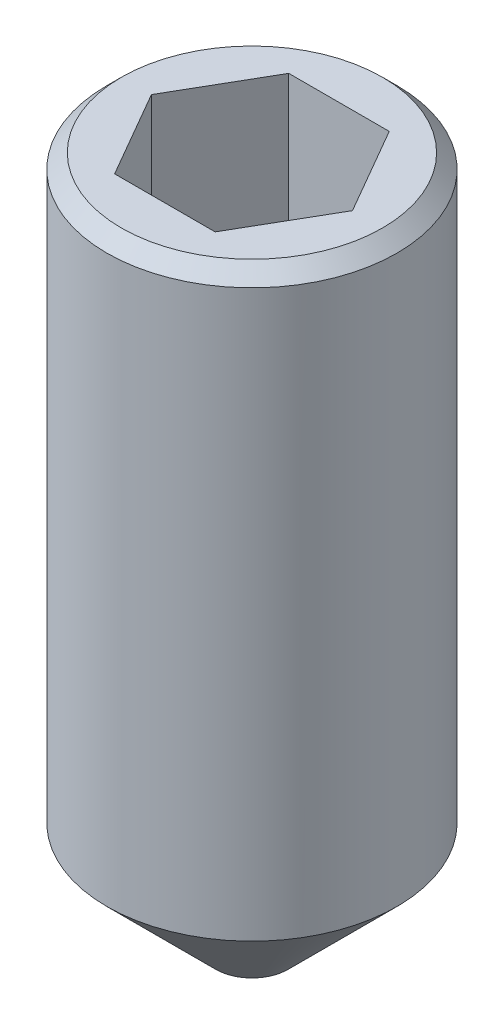
ISO-10303-21;
HEADER;
FILE_DESCRIPTION(('STEP AP214'),'2;1');
FILE_NAME('part.step','',(''),(''),'','','');
FILE_SCHEMA(('AUTOMOTIVE_DESIGN { 1 0 10303 214 1 1 1 1 }'));
ENDSEC;
DATA;
#1=APPLICATION_CONTEXT('core data for automotive mechanical design processes');
#2=APPLICATION_PROTOCOL_DEFINITION('international standard','automotive_design',2000,#1);
#3=PRODUCT_CONTEXT('',#1,'mechanical');
#4=PRODUCT('Part','Part','',(#3));
#5=PRODUCT_RELATED_PRODUCT_CATEGORY('part','',(#4));
#6=PRODUCT_DEFINITION_FORMATION('','',#4);
#7=PRODUCT_DEFINITION_CONTEXT('part definition',#1,'design');
#8=PRODUCT_DEFINITION('design','',#6,#7);
#9=PRODUCT_DEFINITION_SHAPE('','',#8);
#10=(LENGTH_UNIT() NAMED_UNIT(*) SI_UNIT(.MILLI.,.METRE.));
#11=(NAMED_UNIT(*) PLANE_ANGLE_UNIT() SI_UNIT($,.RADIAN.));
#12=(NAMED_UNIT(*) SI_UNIT($,.STERADIAN.) SOLID_ANGLE_UNIT());
#13=UNCERTAINTY_MEASURE_WITH_UNIT(LENGTH_MEASURE(1.E-05),#10,'distance_accuracy_value','');
#14=(GEOMETRIC_REPRESENTATION_CONTEXT(3) GLOBAL_UNCERTAINTY_ASSIGNED_CONTEXT((#13)) GLOBAL_UNIT_ASSIGNED_CONTEXT((#10,
#11,#12)) REPRESENTATION_CONTEXT('',''));
#15=CARTESIAN_POINT('',(0.,0.,0.));
#16=DIRECTION('',(0.,0.,1.));
#17=DIRECTION('',(1.,0.,0.));
#18=AXIS2_PLACEMENT_3D('',#15,#16,#17);
#19=CARTESIAN_POINT('',(0.,0.,0.));
#20=DIRECTION('',(0.,-1.,0.));
#21=DIRECTION('',(0.,0.,-1.));
#22=AXIS2_PLACEMENT_3D('',#19,#20,#21);
#23=PLANE('',#22);
#24=CARTESIAN_POINT('',(0.,0.,0.));
#25=DIRECTION('',(0.,-1.,0.));
#26=DIRECTION('',(0.,0.,-1.));
#27=AXIS2_PLACEMENT_3D('',#24,#25,#26);
#28=CIRCLE('',#27,0.900000000000001);
#29=CARTESIAN_POINT('',(0.,0.,-0.900000000000001));
#30=VERTEX_POINT('',#29);
#31=EDGE_CURVE('E43',#30,#30,#28,.F.);
#32=ORIENTED_EDGE('',*,*,#31,.T.);
#33=EDGE_LOOP('',(#32));
#34=FACE_BOUND('',#33,.T.);
#35=DIRECTION('',(1.,0.,0.));
#36=VECTOR('',#35,1.);
#37=CARTESIAN_POINT('',(-0.346410161513775,0.,0.6));
#38=LINE('',#37,#36);
#39=CARTESIAN_POINT('',(-0.346410161513775,0.,0.6));
#40=VERTEX_POINT('',#39);
#41=CARTESIAN_POINT('',(0.346410161513775,0.,0.6));
#42=VERTEX_POINT('',#41);
#43=EDGE_CURVE('E124',#40,#42,#38,.T.);
#44=ORIENTED_EDGE('',*,*,#43,.F.);
#45=DIRECTION('',(0.5,0.,0.866025403784438));
#46=VECTOR('',#45,1.);
#47=CARTESIAN_POINT('',(-0.692820323027551,0.,0.));
#48=LINE('',#47,#46);
#49=CARTESIAN_POINT('',(-0.692820323027551,0.,0.));
#50=VERTEX_POINT('',#49);
#51=EDGE_CURVE('E50',#50,#40,#48,.T.);
#52=ORIENTED_EDGE('',*,*,#51,.F.);
#53=DIRECTION('',(-0.5,0.,0.866025403784439));
#54=VECTOR('',#53,1.);
#55=CARTESIAN_POINT('',(-0.346410161513776,0.,-0.6));
#56=LINE('',#55,#54);
#57=CARTESIAN_POINT('',(-0.346410161513776,0.,-0.6));
#58=VERTEX_POINT('',#57);
#59=EDGE_CURVE('E133',#58,#50,#56,.T.);
#60=ORIENTED_EDGE('',*,*,#59,.F.);
#61=DIRECTION('',(-1.,0.,0.));
#62=VECTOR('',#61,1.);
#63=CARTESIAN_POINT('',(0.346410161513775,0.,-0.6));
#64=LINE('',#63,#62);
#65=CARTESIAN_POINT('',(0.346410161513775,0.,-0.6));
#66=VERTEX_POINT('',#65);
#67=EDGE_CURVE('E131',#66,#58,#64,.T.);
#68=ORIENTED_EDGE('',*,*,#67,.F.);
#69=DIRECTION('',(-0.5,0.,-0.866025403784438));
#70=VECTOR('',#69,1.);
#71=CARTESIAN_POINT('',(0.692820323027551,0.,0.));
#72=LINE('',#71,#70);
#73=CARTESIAN_POINT('',(0.692820323027551,0.,0.));
#74=VERTEX_POINT('',#73);
#75=EDGE_CURVE('E98',#74,#66,#72,.T.);
#76=ORIENTED_EDGE('',*,*,#75,.F.);
#77=DIRECTION('',(0.5,0.,-0.866025403784439));
#78=VECTOR('',#77,1.);
#79=CARTESIAN_POINT('',(0.346410161513775,0.,0.6));
#80=LINE('',#79,#78);
#81=EDGE_CURVE('E127',#42,#74,#80,.T.);
#82=ORIENTED_EDGE('',*,*,#81,.F.);
#83=EDGE_LOOP('',(#44,#52,#60,#68,#76,#82));
#84=FACE_BOUND('',#83,.T.);
#85=ADVANCED_FACE('F35',(#34,#84),#23,.F.);
#86=CARTESIAN_POINT('',(0.,8.71350028878554,0.));
#87=DIRECTION('',(0.,1.,0.));
#88=DIRECTION('',(0.,0.,1.));
#89=AXIS2_PLACEMENT_3D('',#86,#87,#88);
#90=CYLINDRICAL_SURFACE('',#89,1.);
#91=CARTESIAN_POINT('',(0.,-0.0999999999999994,0.));
#92=DIRECTION('',(0.,-1.,0.));
#93=DIRECTION('',(0.,0.,-1.));
#94=AXIS2_PLACEMENT_3D('',#91,#92,#93);
#95=CIRCLE('',#94,1.);
#96=CARTESIAN_POINT('',(0.,-0.0999999999999994,-1.));
#97=VERTEX_POINT('',#96);
#98=EDGE_CURVE('E11',#97,#97,#95,.T.);
#99=ORIENTED_EDGE('',*,*,#98,.T.);
#100=EDGE_LOOP('',(#99));
#101=FACE_BOUND('',#100,.T.);
#102=CARTESIAN_POINT('',(0.,-4.,0.));
#103=DIRECTION('',(0.,1.,0.));
#104=DIRECTION('',(0.,0.,1.));
#105=AXIS2_PLACEMENT_3D('',#102,#103,#104);
#106=CIRCLE('',#105,1.);
#107=CARTESIAN_POINT('',(0.,-4.,1.));
#108=VERTEX_POINT('',#107);
#109=EDGE_CURVE('E145',#108,#108,#106,.T.);
#110=ORIENTED_EDGE('',*,*,#109,.T.);
#111=EDGE_LOOP('',(#110));
#112=FACE_BOUND('',#111,.T.);
#113=ADVANCED_FACE('F161',(#101,#112),#90,.T.);
#114=CARTESIAN_POINT('',(0.,-4.75,0.));
#115=DIRECTION('',(0.,1.,0.));
#116=DIRECTION('',(0.,0.,1.));
#117=AXIS2_PLACEMENT_3D('',#114,#115,#116);
#118=CONICAL_SURFACE('',#117,0.250000000000002,0.785398163397448);
#119=CARTESIAN_POINT('',(0.,-4.75,0.));
#120=DIRECTION('',(0.,1.,0.));
#121=DIRECTION('',(0.,0.,1.));
#122=AXIS2_PLACEMENT_3D('',#119,#120,#121);
#123=CIRCLE('',#122,0.250000000000002);
#124=CARTESIAN_POINT('',(0.,-4.75,0.250000000000001));
#125=VERTEX_POINT('',#124);
#126=EDGE_CURVE('E137',#125,#125,#123,.T.);
#127=CARTESIAN_POINT('',(0.,-4.,1.));
#128=CARTESIAN_POINT('',(0.,-4.0078125,0.992187500000001));
#129=CARTESIAN_POINT('',(0.,-4.015625,0.984375000000001));
#130=CARTESIAN_POINT('',(0.,-4.03125,0.968750000000001));
#131=CARTESIAN_POINT('',(0.,-4.0390625,0.960937500000001));
#132=CARTESIAN_POINT('',(0.,-4.0546875,0.945312500000001));
#133=CARTESIAN_POINT('',(0.,-4.0625,0.937500000000001));
#134=CARTESIAN_POINT('',(0.,-4.078125,0.921875000000001));
#135=CARTESIAN_POINT('',(0.,-4.0859375,0.914062500000001));
#136=CARTESIAN_POINT('',(0.,-4.1015625,0.898437500000001));
#137=CARTESIAN_POINT('',(0.,-4.109375,0.890625000000001));
#138=CARTESIAN_POINT('',(0.,-4.125,0.875000000000001));
#139=CARTESIAN_POINT('',(0.,-4.1328125,0.867187500000001));
#140=CARTESIAN_POINT('',(0.,-4.1484375,0.851562500000001));
#141=CARTESIAN_POINT('',(0.,-4.15625,0.843750000000001));
#142=CARTESIAN_POINT('',(0.,-4.171875,0.828125000000001));
#143=CARTESIAN_POINT('',(0.,-4.1796875,0.820312500000001));
#144=CARTESIAN_POINT('',(0.,-4.1953125,0.804687500000001));
#145=CARTESIAN_POINT('',(0.,-4.203125,0.796875000000001));
#146=CARTESIAN_POINT('',(0.,-4.21875,0.781250000000001));
#147=CARTESIAN_POINT('',(0.,-4.2265625,0.773437500000001));
#148=CARTESIAN_POINT('',(0.,-4.2421875,0.757812500000001));
#149=CARTESIAN_POINT('',(0.,-4.25,0.750000000000001));
#150=CARTESIAN_POINT('',(0.,-4.265625,0.734375000000001));
#151=CARTESIAN_POINT('',(0.,-4.2734375,0.726562500000001));
#152=CARTESIAN_POINT('',(0.,-4.2890625,0.710937500000001));
#153=CARTESIAN_POINT('',(0.,-4.296875,0.703125000000001));
#154=CARTESIAN_POINT('',(0.,-4.3125,0.687500000000001));
#155=CARTESIAN_POINT('',(0.,-4.3203125,0.679687500000001));
#156=CARTESIAN_POINT('',(0.,-4.3359375,0.664062500000001));
#157=CARTESIAN_POINT('',(0.,-4.34375,0.656250000000001));
#158=CARTESIAN_POINT('',(0.,-4.359375,0.640625000000001));
#159=CARTESIAN_POINT('',(0.,-4.3671875,0.632812500000001));
#160=CARTESIAN_POINT('',(0.,-4.3828125,0.617187500000001));
#161=CARTESIAN_POINT('',(0.,-4.390625,0.609375000000001));
#162=CARTESIAN_POINT('',(0.,-4.40625,0.593750000000001));
#163=CARTESIAN_POINT('',(0.,-4.4140625,0.585937500000001));
#164=CARTESIAN_POINT('',(0.,-4.4296875,0.570312500000001));
#165=CARTESIAN_POINT('',(0.,-4.4375,0.562500000000001));
#166=CARTESIAN_POINT('',(0.,-4.453125,0.546875000000001));
#167=CARTESIAN_POINT('',(0.,-4.4609375,0.539062500000001));
#168=CARTESIAN_POINT('',(0.,-4.4765625,0.523437500000001));
#169=CARTESIAN_POINT('',(0.,-4.484375,0.515625000000001));
#170=CARTESIAN_POINT('',(0.,-4.5,0.500000000000001));
#171=CARTESIAN_POINT('',(0.,-4.5078125,0.492187500000001));
#172=CARTESIAN_POINT('',(0.,-4.5234375,0.476562500000001));
#173=CARTESIAN_POINT('',(0.,-4.53125,0.468750000000001));
#174=CARTESIAN_POINT('',(0.,-4.546875,0.453125000000001));
#175=CARTESIAN_POINT('',(0.,-4.5546875,0.445312500000001));
#176=CARTESIAN_POINT('',(0.,-4.5703125,0.429687500000001));
#177=CARTESIAN_POINT('',(0.,-4.578125,0.421875000000001));
#178=CARTESIAN_POINT('',(0.,-4.59375,0.406250000000001));
#179=CARTESIAN_POINT('',(0.,-4.6015625,0.398437500000001));
#180=CARTESIAN_POINT('',(0.,-4.6171875,0.382812500000001));
#181=CARTESIAN_POINT('',(0.,-4.625,0.375000000000001));
#182=CARTESIAN_POINT('',(0.,-4.640625,0.359375000000001));
#183=CARTESIAN_POINT('',(0.,-4.6484375,0.351562500000001));
#184=CARTESIAN_POINT('',(0.,-4.6640625,0.335937500000001));
#185=CARTESIAN_POINT('',(0.,-4.671875,0.328125000000001));
#186=CARTESIAN_POINT('',(0.,-4.6875,0.312500000000001));
#187=CARTESIAN_POINT('',(0.,-4.6953125,0.304687500000001));
#188=CARTESIAN_POINT('',(0.,-4.7109375,0.289062500000001));
#189=CARTESIAN_POINT('',(0.,-4.71875,0.281250000000001));
#190=CARTESIAN_POINT('',(0.,-4.734375,0.265625000000001));
#191=CARTESIAN_POINT('',(0.,-4.7421875,0.257812500000002));
#192=CARTESIAN_POINT('',(0.,-4.75,0.250000000000001));
#193=B_SPLINE_CURVE_WITH_KNOTS('',3,(#127,#128,#129,#130,#131,#132,#133,#134,#135,#136,#137,
#138,#139,#140,#141,#142,#143,#144,#145,#146,#147,#148,#149,#150,#151,#152,#153,#154,#155,#156,
#157,#158,#159,#160,#161,#162,#163,#164,#165,#166,#167,#168,#169,#170,#171,#172,#173,#174,#175,
#176,#177,#178,#179,#180,#181,#182,#183,#184,#185,#186,#187,#188,#189,#190,#191,#192),
.UNSPECIFIED.,.F.,.F.,(4,2,2,2,2,2,2,2,2,2,2,2,2,2,2,2,2,2,2,2,2,2,2,2,2,2,2,2,2,2,2,2,4),(0.,
0.0331456303681201,0.0662912607362389,0.099436891104359,0.132582521472478,0.165728151840598,
0.198873782208717,0.232019412576837,0.265165042944955,0.298310673313075,0.331456303681194,
0.364601934049314,0.397747564417433,0.430893194785553,0.464038825153672,0.497184455521792,
0.530330085889911,0.563475716258031,0.59662134662615,0.62976697699427,0.662912607362388,
0.696058237730508,0.729203868098627,0.762349498466747,0.795495128834866,0.828640759202986,
0.861786389571105,0.894932019939225,0.928077650307344,0.961223280675464,0.994368911043583,
1.0275145414117,1.06066017177982),.UNSPECIFIED.);
#194=EDGE_CURVE('BSEAM165',#108,#125,#193,.T.);
#195=ORIENTED_EDGE('',*,*,#109,.F.);
#196=ORIENTED_EDGE('',*,*,#126,.T.);
#197=ORIENTED_EDGE('',*,*,#194,.T.);
#198=ORIENTED_EDGE('',*,*,#194,.F.);
#199=EDGE_LOOP('',(#195,#197,#196,#198));
#200=FACE_BOUND('',#199,.T.);
#201=ADVANCED_FACE('F165',(#200),#118,.T.);
#202=CARTESIAN_POINT('',(0.250000000000002,-4.75,0.));
#203=DIRECTION('',(0.,1.,0.));
#204=DIRECTION('',(0.,0.,1.));
#205=AXIS2_PLACEMENT_3D('',#202,#203,#204);
#206=PLANE('',#205);
#207=ORIENTED_EDGE('',*,*,#126,.F.);
#208=EDGE_LOOP('',(#207));
#209=FACE_BOUND('',#208,.T.);
#210=ADVANCED_FACE('F171',(#209),#206,.F.);
#211=CARTESIAN_POINT('',(-0.692820323027551,-1.5,0.));
#212=DIRECTION('',(-0.866025403784439,0.,0.5));
#213=DIRECTION('',(0.5,0.,0.866025403784439));
#214=AXIS2_PLACEMENT_3D('',#211,#212,#213);
#215=PLANE('',#214);
#216=ORIENTED_EDGE('',*,*,#51,.T.);
#217=DIRECTION('',(0.,1.,0.));
#218=VECTOR('',#217,1.);
#219=CARTESIAN_POINT('',(-0.346410161513775,-1.5,0.6));
#220=LINE('',#219,#218);
#221=CARTESIAN_POINT('',(-0.346410161513775,-1.5,0.6));
#222=VERTEX_POINT('',#221);
#223=EDGE_CURVE('E80',#222,#40,#220,.T.);
#224=ORIENTED_EDGE('',*,*,#223,.F.);
#225=DIRECTION('',(0.5,0.,0.866025403784438));
#226=VECTOR('',#225,1.);
#227=CARTESIAN_POINT('',(-0.692820323027551,-1.5,0.));
#228=LINE('',#227,#226);
#229=CARTESIAN_POINT('',(-0.692820323027551,-1.5,0.));
#230=VERTEX_POINT('',#229);
#231=EDGE_CURVE('E135',#230,#222,#228,.T.);
#232=ORIENTED_EDGE('',*,*,#231,.F.);
#233=DIRECTION('',(0.,1.,0.));
#234=VECTOR('',#233,1.);
#235=CARTESIAN_POINT('',(-0.692820323027551,-1.5,0.));
#236=LINE('',#235,#234);
#237=EDGE_CURVE('E58',#230,#50,#236,.T.);
#238=ORIENTED_EDGE('',*,*,#237,.T.);
#239=EDGE_LOOP('',(#216,#224,#232,#238));
#240=FACE_BOUND('',#239,.T.);
#241=ADVANCED_FACE('F175',(#240),#215,.F.);
#242=CARTESIAN_POINT('',(-0.346410161513776,-1.5,-0.6));
#243=DIRECTION('',(-0.866025403784439,0.,-0.5));
#244=DIRECTION('',(-0.5,0.,0.866025403784439));
#245=AXIS2_PLACEMENT_3D('',#242,#243,#244);
#246=PLANE('',#245);
#247=ORIENTED_EDGE('',*,*,#59,.T.);
#248=ORIENTED_EDGE('',*,*,#237,.F.);
#249=DIRECTION('',(-0.5,0.,0.866025403784439));
#250=VECTOR('',#249,1.);
#251=CARTESIAN_POINT('',(-0.346410161513776,-1.5,-0.6));
#252=LINE('',#251,#250);
#253=CARTESIAN_POINT('',(-0.346410161513776,-1.5,-0.6));
#254=VERTEX_POINT('',#253);
#255=EDGE_CURVE('E110',#254,#230,#252,.T.);
#256=ORIENTED_EDGE('',*,*,#255,.F.);
#257=DIRECTION('',(0.,1.,0.));
#258=VECTOR('',#257,1.);
#259=CARTESIAN_POINT('',(-0.346410161513776,-1.5,-0.6));
#260=LINE('',#259,#258);
#261=EDGE_CURVE('E102',#254,#58,#260,.T.);
#262=ORIENTED_EDGE('',*,*,#261,.T.);
#263=EDGE_LOOP('',(#247,#248,#256,#262));
#264=FACE_BOUND('',#263,.T.);
#265=ADVANCED_FACE('F179',(#264),#246,.F.);
#266=CARTESIAN_POINT('',(0.346410161513775,-1.5,-0.6));
#267=DIRECTION('',(0.,0.,-1.));
#268=DIRECTION('',(-1.,0.,0.));
#269=AXIS2_PLACEMENT_3D('',#266,#267,#268);
#270=PLANE('',#269);
#271=ORIENTED_EDGE('',*,*,#67,.T.);
#272=ORIENTED_EDGE('',*,*,#261,.F.);
#273=DIRECTION('',(-1.,0.,0.));
#274=VECTOR('',#273,1.);
#275=CARTESIAN_POINT('',(0.346410161513775,-1.5,-0.6));
#276=LINE('',#275,#274);
#277=CARTESIAN_POINT('',(0.346410161513775,-1.5,-0.6));
#278=VERTEX_POINT('',#277);
#279=EDGE_CURVE('E106',#278,#254,#276,.T.);
#280=ORIENTED_EDGE('',*,*,#279,.F.);
#281=DIRECTION('',(0.,1.,0.));
#282=VECTOR('',#281,1.);
#283=CARTESIAN_POINT('',(0.346410161513775,-1.5,-0.6));
#284=LINE('',#283,#282);
#285=EDGE_CURVE('E91',#278,#66,#284,.T.);
#286=ORIENTED_EDGE('',*,*,#285,.T.);
#287=EDGE_LOOP('',(#271,#272,#280,#286));
#288=FACE_BOUND('',#287,.T.);
#289=ADVANCED_FACE('F107',(#288),#270,.F.);
#290=CARTESIAN_POINT('',(0.692820323027551,-1.5,0.));
#291=DIRECTION('',(0.866025403784438,0.,-0.5));
#292=DIRECTION('',(-0.5,0.,-0.866025403784438));
#293=AXIS2_PLACEMENT_3D('',#290,#291,#292);
#294=PLANE('',#293);
#295=ORIENTED_EDGE('',*,*,#75,.T.);
#296=ORIENTED_EDGE('',*,*,#285,.F.);
#297=DIRECTION('',(-0.5,0.,-0.866025403784438));
#298=VECTOR('',#297,1.);
#299=CARTESIAN_POINT('',(0.692820323027551,-1.5,0.));
#300=LINE('',#299,#298);
#301=CARTESIAN_POINT('',(0.692820323027551,-1.5,0.));
#302=VERTEX_POINT('',#301);
#303=EDGE_CURVE('E95',#302,#278,#300,.T.);
#304=ORIENTED_EDGE('',*,*,#303,.F.);
#305=DIRECTION('',(0.,1.,0.));
#306=VECTOR('',#305,1.);
#307=CARTESIAN_POINT('',(0.692820323027551,-1.5,0.));
#308=LINE('',#307,#306);
#309=EDGE_CURVE('E103',#302,#74,#308,.T.);
#310=ORIENTED_EDGE('',*,*,#309,.T.);
#311=EDGE_LOOP('',(#295,#296,#304,#310));
#312=FACE_BOUND('',#311,.T.);
#313=ADVANCED_FACE('F93',(#312),#294,.F.);
#314=CARTESIAN_POINT('',(0.346410161513775,-1.5,0.6));
#315=DIRECTION('',(0.866025403784439,0.,0.5));
#316=DIRECTION('',(0.5,0.,-0.866025403784439));
#317=AXIS2_PLACEMENT_3D('',#314,#315,#316);
#318=PLANE('',#317);
#319=ORIENTED_EDGE('',*,*,#81,.T.);
#320=ORIENTED_EDGE('',*,*,#309,.F.);
#321=DIRECTION('',(0.5,0.,-0.866025403784439));
#322=VECTOR('',#321,1.);
#323=CARTESIAN_POINT('',(0.346410161513775,-1.5,0.6));
#324=LINE('',#323,#322);
#325=CARTESIAN_POINT('',(0.346410161513775,-1.5,0.6));
#326=VERTEX_POINT('',#325);
#327=EDGE_CURVE('E116',#326,#302,#324,.T.);
#328=ORIENTED_EDGE('',*,*,#327,.F.);
#329=DIRECTION('',(0.,1.,0.));
#330=VECTOR('',#329,1.);
#331=CARTESIAN_POINT('',(0.346410161513775,-1.5,0.6));
#332=LINE('',#331,#330);
#333=EDGE_CURVE('E140',#326,#42,#332,.T.);
#334=ORIENTED_EDGE('',*,*,#333,.T.);
#335=EDGE_LOOP('',(#319,#320,#328,#334));
#336=FACE_BOUND('',#335,.T.);
#337=ADVANCED_FACE('F182',(#336),#318,.F.);
#338=CARTESIAN_POINT('',(-0.346410161513775,-1.5,0.6));
#339=DIRECTION('',(0.,0.,1.));
#340=DIRECTION('',(1.,0.,0.));
#341=AXIS2_PLACEMENT_3D('',#338,#339,#340);
#342=PLANE('',#341);
#343=ORIENTED_EDGE('',*,*,#43,.T.);
#344=ORIENTED_EDGE('',*,*,#333,.F.);
#345=DIRECTION('',(1.,0.,0.));
#346=VECTOR('',#345,1.);
#347=CARTESIAN_POINT('',(-0.346410161513775,-1.5,0.6));
#348=LINE('',#347,#346);
#349=EDGE_CURVE('E118',#222,#326,#348,.T.);
#350=ORIENTED_EDGE('',*,*,#349,.F.);
#351=ORIENTED_EDGE('',*,*,#223,.T.);
#352=EDGE_LOOP('',(#343,#344,#350,#351));
#353=FACE_BOUND('',#352,.T.);
#354=ADVANCED_FACE('F157',(#353),#342,.F.);
#355=CARTESIAN_POINT('',(0.,-1.5,0.));
#356=DIRECTION('',(0.,1.,0.));
#357=DIRECTION('',(0.,0.,1.));
#358=AXIS2_PLACEMENT_3D('',#355,#356,#357);
#359=PLANE('',#358);
#360=ORIENTED_EDGE('',*,*,#231,.T.);
#361=ORIENTED_EDGE('',*,*,#349,.T.);
#362=ORIENTED_EDGE('',*,*,#327,.T.);
#363=ORIENTED_EDGE('',*,*,#303,.T.);
#364=ORIENTED_EDGE('',*,*,#279,.T.);
#365=ORIENTED_EDGE('',*,*,#255,.T.);
#366=EDGE_LOOP('',(#360,#361,#362,#363,#364,#365));
#367=FACE_BOUND('',#366,.T.);
#368=ADVANCED_FACE('F113',(#367),#359,.T.);
#369=CARTESIAN_POINT('',(0.,0.,0.));
#370=DIRECTION('',(0.,-1.,0.));
#371=DIRECTION('',(0.,0.,-1.));
#372=AXIS2_PLACEMENT_3D('',#369,#370,#371);
#373=CONICAL_SURFACE('',#372,0.900000000000001,0.78539816339745);
#374=ORIENTED_EDGE('',*,*,#98,.F.);
#375=EDGE_LOOP('',(#374));
#376=FACE_BOUND('',#375,.T.);
#377=ORIENTED_EDGE('',*,*,#31,.F.);
#378=EDGE_LOOP('',(#377));
#379=FACE_BOUND('',#378,.T.);
#380=ADVANCED_FACE('F37',(#376,#379),#373,.T.);
#381=CLOSED_SHELL('',(#85,#113,#201,#210,#241,#265,#289,#313,#337,#354,#368,#380));
#382=MANIFOLD_SOLID_BREP('B2',#381);
#383=ADVANCED_BREP_SHAPE_REPRESENTATION('',(#18,#382),#14);
#384=SHAPE_DEFINITION_REPRESENTATION(#9,#383);
ENDSEC;
END-ISO-10303-21;
